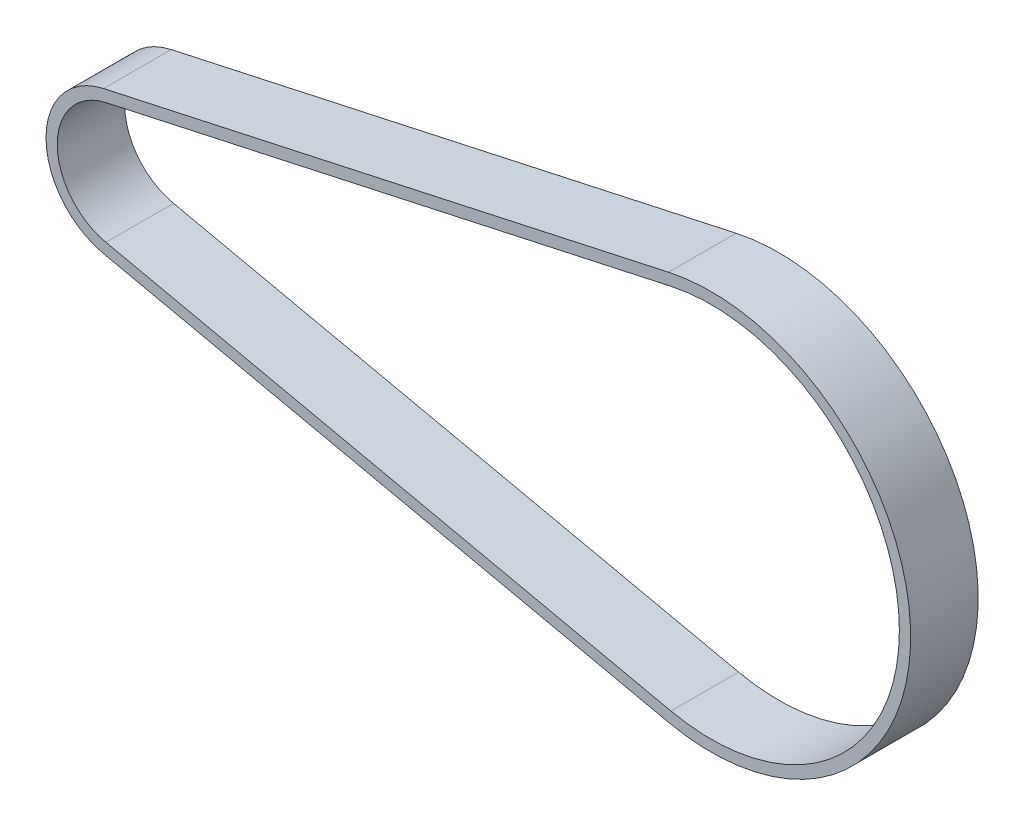
ISO-10303-21;
HEADER;
FILE_DESCRIPTION(('STEP AP214'),'2;1');
FILE_NAME('part.step','',(''),(''),'','','');
FILE_SCHEMA(('AUTOMOTIVE_DESIGN { 1 0 10303 214 1 1 1 1 }'));
ENDSEC;
DATA;
#1=APPLICATION_CONTEXT('core data for automotive mechanical design processes');
#2=APPLICATION_PROTOCOL_DEFINITION('international standard','automotive_design',2000,#1);
#3=PRODUCT_CONTEXT('',#1,'mechanical');
#4=PRODUCT('Part','Part','',(#3));
#5=PRODUCT_RELATED_PRODUCT_CATEGORY('part','',(#4));
#6=PRODUCT_DEFINITION_FORMATION('','',#4);
#7=PRODUCT_DEFINITION_CONTEXT('part definition',#1,'design');
#8=PRODUCT_DEFINITION('design','',#6,#7);
#9=PRODUCT_DEFINITION_SHAPE('','',#8);
#10=(LENGTH_UNIT() NAMED_UNIT(*) SI_UNIT(.MILLI.,.METRE.));
#11=(NAMED_UNIT(*) PLANE_ANGLE_UNIT() SI_UNIT($,.RADIAN.));
#12=(NAMED_UNIT(*) SI_UNIT($,.STERADIAN.) SOLID_ANGLE_UNIT());
#13=UNCERTAINTY_MEASURE_WITH_UNIT(LENGTH_MEASURE(1.E-05),#10,'distance_accuracy_value','');
#14=(GEOMETRIC_REPRESENTATION_CONTEXT(3) GLOBAL_UNCERTAINTY_ASSIGNED_CONTEXT((#13)) GLOBAL_UNIT_ASSIGNED_CONTEXT((#10,
#11,#12)) REPRESENTATION_CONTEXT('',''));
#15=CARTESIAN_POINT('',(0.,0.,0.));
#16=DIRECTION('',(0.,0.,1.));
#17=DIRECTION('',(1.,0.,0.));
#18=AXIS2_PLACEMENT_3D('',#15,#16,#17);
#19=CARTESIAN_POINT('',(0.,0.,6.));
#20=DIRECTION('',(0.,0.,1.));
#21=DIRECTION('',(1.,0.,0.));
#22=AXIS2_PLACEMENT_3D('',#19,#20,#21);
#23=PLANE('',#22);
#24=CARTESIAN_POINT('',(0.,0.,6.));
#25=DIRECTION('',(0.,0.,1.));
#26=DIRECTION('',(1.,0.,0.));
#27=AXIS2_PLACEMENT_3D('',#24,#25,#26);
#28=CIRCLE('',#27,6.5);
#29=CARTESIAN_POINT('',(-1.38716119828816,6.35025856244954,6.));
#30=VERTEX_POINT('',#29);
#31=CARTESIAN_POINT('',(-1.38716119828816,-6.35025856244954,6.));
#32=VERTEX_POINT('',#31);
#33=EDGE_CURVE('E153',#30,#32,#28,.T.);
#34=ORIENTED_EDGE('',*,*,#33,.T.);
#35=DIRECTION('',(0.976962855761468,-0.213409415121255,0.));
#36=VECTOR('',#35,1.);
#37=CARTESIAN_POINT('',(-1.38716119828816,-6.35025856244954,6.));
#38=LINE('',#37,#36);
#39=CARTESIAN_POINT('',(48.7933851640514,-17.3117818040932,6.));
#40=VERTEX_POINT('',#39);
#41=EDGE_CURVE('E157',#32,#40,#38,.T.);
#42=ORIENTED_EDGE('',*,*,#41,.T.);
#43=CARTESIAN_POINT('',(52.575,0.,6.));
#44=DIRECTION('',(0.,0.,1.));
#45=DIRECTION('',(1.,0.,0.));
#46=AXIS2_PLACEMENT_3D('',#43,#44,#45);
#47=CIRCLE('',#46,17.72);
#48=CARTESIAN_POINT('',(48.7933851640514,17.3117818040932,6.));
#49=VERTEX_POINT('',#48);
#50=EDGE_CURVE('E161',#40,#49,#47,.T.);
#51=ORIENTED_EDGE('',*,*,#50,.T.);
#52=DIRECTION('',(-0.976962855761469,-0.213409415121255,0.));
#53=VECTOR('',#52,1.);
#54=CARTESIAN_POINT('',(-1.38716119828816,6.35025856244954,6.));
#55=LINE('',#54,#53);
#56=EDGE_CURVE('E164',#49,#30,#55,.T.);
#57=ORIENTED_EDGE('',*,*,#56,.T.);
#58=EDGE_LOOP('',(#34,#42,#51,#57));
#59=FACE_BOUND('',#58,.T.);
#60=DIRECTION('',(0.976962855761468,-0.213409415121255,0.));
#61=VECTOR('',#60,1.);
#62=CARTESIAN_POINT('',(-1.1737517831669,-5.37329570668807,6.));
#63=LINE('',#62,#61);
#64=CARTESIAN_POINT('',(-1.1737517831669,-5.37329570668807,6.));
#65=VERTEX_POINT('',#64);
#66=CARTESIAN_POINT('',(49.0067945791726,-16.3348189483318,6.));
#67=VERTEX_POINT('',#66);
#68=EDGE_CURVE('E114',#65,#67,#63,.T.);
#69=ORIENTED_EDGE('',*,*,#68,.F.);
#70=CARTESIAN_POINT('',(0.,0.,6.));
#71=DIRECTION('',(0.,0.,1.));
#72=DIRECTION('',(1.,0.,0.));
#73=AXIS2_PLACEMENT_3D('',#70,#71,#72);
#74=CIRCLE('',#73,5.5);
#75=CARTESIAN_POINT('',(-1.1737517831669,5.37329570668808,6.));
#76=VERTEX_POINT('',#75);
#77=EDGE_CURVE('E105',#76,#65,#74,.T.);
#78=ORIENTED_EDGE('',*,*,#77,.F.);
#79=DIRECTION('',(-0.976962855761468,-0.213409415121255,0.));
#80=VECTOR('',#79,1.);
#81=CARTESIAN_POINT('',(-1.1737517831669,5.37329570668808,6.));
#82=LINE('',#81,#80);
#83=CARTESIAN_POINT('',(49.0067945791726,16.3348189483318,6.));
#84=VERTEX_POINT('',#83);
#85=EDGE_CURVE('E131',#84,#76,#82,.T.);
#86=ORIENTED_EDGE('',*,*,#85,.F.);
#87=CARTESIAN_POINT('',(52.575,0.,6.));
#88=DIRECTION('',(0.,0.,1.));
#89=DIRECTION('',(1.,0.,0.));
#90=AXIS2_PLACEMENT_3D('',#87,#88,#89);
#91=CIRCLE('',#90,16.72);
#92=EDGE_CURVE('E127',#67,#84,#91,.T.);
#93=ORIENTED_EDGE('',*,*,#92,.F.);
#94=EDGE_LOOP('',(#69,#78,#86,#93));
#95=FACE_BOUND('',#94,.T.);
#96=ADVANCED_FACE('F39',(#59,#95),#23,.T.);
#97=CARTESIAN_POINT('',(0.,0.,0.));
#98=DIRECTION('',(0.,0.,1.));
#99=DIRECTION('',(1.,0.,0.));
#100=AXIS2_PLACEMENT_3D('',#97,#98,#99);
#101=PLANE('',#100);
#102=CARTESIAN_POINT('',(0.,0.,0.));
#103=DIRECTION('',(0.,0.,1.));
#104=DIRECTION('',(1.,0.,0.));
#105=AXIS2_PLACEMENT_3D('',#102,#103,#104);
#106=CIRCLE('',#105,6.5);
#107=CARTESIAN_POINT('',(-1.38716119828816,6.35025856244954,0.));
#108=VERTEX_POINT('',#107);
#109=CARTESIAN_POINT('',(-1.38716119828816,-6.35025856244954,0.));
#110=VERTEX_POINT('',#109);
#111=EDGE_CURVE('E123',#108,#110,#106,.T.);
#112=ORIENTED_EDGE('',*,*,#111,.F.);
#113=DIRECTION('',(-0.976962855761469,-0.213409415121255,0.));
#114=VECTOR('',#113,1.);
#115=CARTESIAN_POINT('',(-1.38716119828816,6.35025856244954,0.));
#116=LINE('',#115,#114);
#117=CARTESIAN_POINT('',(48.7933851640514,17.3117818040932,0.));
#118=VERTEX_POINT('',#117);
#119=EDGE_CURVE('E158',#118,#108,#116,.T.);
#120=ORIENTED_EDGE('',*,*,#119,.F.);
#121=CARTESIAN_POINT('',(52.575,0.,0.));
#122=DIRECTION('',(0.,0.,1.));
#123=DIRECTION('',(1.,0.,0.));
#124=AXIS2_PLACEMENT_3D('',#121,#122,#123);
#125=CIRCLE('',#124,17.72);
#126=CARTESIAN_POINT('',(48.7933851640514,-17.3117818040932,0.));
#127=VERTEX_POINT('',#126);
#128=EDGE_CURVE('E174',#127,#118,#125,.T.);
#129=ORIENTED_EDGE('',*,*,#128,.F.);
#130=DIRECTION('',(0.976962855761468,-0.213409415121255,0.));
#131=VECTOR('',#130,1.);
#132=CARTESIAN_POINT('',(-1.38716119828816,-6.35025856244954,0.));
#133=LINE('',#132,#131);
#134=EDGE_CURVE('E171',#110,#127,#133,.T.);
#135=ORIENTED_EDGE('',*,*,#134,.F.);
#136=EDGE_LOOP('',(#112,#120,#129,#135));
#137=FACE_BOUND('',#136,.T.);
#138=CARTESIAN_POINT('',(0.,0.,0.));
#139=DIRECTION('',(0.,0.,1.));
#140=DIRECTION('',(1.,0.,0.));
#141=AXIS2_PLACEMENT_3D('',#138,#139,#140);
#142=CIRCLE('',#141,5.5);
#143=CARTESIAN_POINT('',(-1.1737517831669,5.37329570668808,0.));
#144=VERTEX_POINT('',#143);
#145=CARTESIAN_POINT('',(-1.1737517831669,-5.37329570668807,0.));
#146=VERTEX_POINT('',#145);
#147=EDGE_CURVE('E63',#144,#146,#142,.T.);
#148=ORIENTED_EDGE('',*,*,#147,.T.);
#149=DIRECTION('',(0.976962855761468,-0.213409415121255,0.));
#150=VECTOR('',#149,1.);
#151=CARTESIAN_POINT('',(-1.1737517831669,-5.37329570668807,0.));
#152=LINE('',#151,#150);
#153=CARTESIAN_POINT('',(49.0067945791726,-16.3348189483318,0.));
#154=VERTEX_POINT('',#153);
#155=EDGE_CURVE('E121',#146,#154,#152,.T.);
#156=ORIENTED_EDGE('',*,*,#155,.T.);
#157=CARTESIAN_POINT('',(52.575,0.,0.));
#158=DIRECTION('',(0.,0.,1.));
#159=DIRECTION('',(1.,0.,0.));
#160=AXIS2_PLACEMENT_3D('',#157,#158,#159);
#161=CIRCLE('',#160,16.72);
#162=CARTESIAN_POINT('',(49.0067945791726,16.3348189483318,0.));
#163=VERTEX_POINT('',#162);
#164=EDGE_CURVE('E140',#154,#163,#161,.T.);
#165=ORIENTED_EDGE('',*,*,#164,.T.);
#166=DIRECTION('',(-0.976962855761468,-0.213409415121255,0.));
#167=VECTOR('',#166,1.);
#168=CARTESIAN_POINT('',(-1.1737517831669,5.37329570668808,0.));
#169=LINE('',#168,#167);
#170=EDGE_CURVE('E115',#163,#144,#169,.T.);
#171=ORIENTED_EDGE('',*,*,#170,.T.);
#172=EDGE_LOOP('',(#148,#156,#165,#171));
#173=FACE_BOUND('',#172,.T.);
#174=ADVANCED_FACE('F197',(#137,#173),#101,.F.);
#175=CARTESIAN_POINT('',(0.,0.,6.));
#176=DIRECTION('',(0.,0.,-1.));
#177=DIRECTION('',(-1.,0.,0.));
#178=AXIS2_PLACEMENT_3D('',#175,#176,#177);
#179=CYLINDRICAL_SURFACE('',#178,6.5);
#180=ORIENTED_EDGE('',*,*,#111,.T.);
#181=DIRECTION('',(0.,0.,-1.));
#182=VECTOR('',#181,1.);
#183=CARTESIAN_POINT('',(-1.38716119828816,-6.35025856244954,6.));
#184=LINE('',#183,#182);
#185=EDGE_CURVE('E11',#32,#110,#184,.T.);
#186=ORIENTED_EDGE('',*,*,#185,.F.);
#187=ORIENTED_EDGE('',*,*,#33,.F.);
#188=DIRECTION('',(0.,0.,-1.));
#189=VECTOR('',#188,1.);
#190=CARTESIAN_POINT('',(-1.38716119828816,6.35025856244954,6.));
#191=LINE('',#190,#189);
#192=EDGE_CURVE('E167',#30,#108,#191,.T.);
#193=ORIENTED_EDGE('',*,*,#192,.T.);
#194=EDGE_LOOP('',(#180,#186,#187,#193));
#195=FACE_BOUND('',#194,.T.);
#196=ADVANCED_FACE('F41',(#195),#179,.T.);
#197=CARTESIAN_POINT('',(-1.38716119828816,-6.35025856244954,6.));
#198=DIRECTION('',(0.213409415121255,0.976962855761468,0.));
#199=DIRECTION('',(-0.976962855761469,0.213409415121255,0.));
#200=AXIS2_PLACEMENT_3D('',#197,#198,#199);
#201=PLANE('',#200);
#202=ORIENTED_EDGE('',*,*,#134,.T.);
#203=DIRECTION('',(0.,0.,-1.));
#204=VECTOR('',#203,1.);
#205=CARTESIAN_POINT('',(48.7933851640514,-17.3117818040932,6.));
#206=LINE('',#205,#204);
#207=EDGE_CURVE('E48',#40,#127,#206,.T.);
#208=ORIENTED_EDGE('',*,*,#207,.F.);
#209=ORIENTED_EDGE('',*,*,#41,.F.);
#210=ORIENTED_EDGE('',*,*,#185,.T.);
#211=EDGE_LOOP('',(#202,#208,#209,#210));
#212=FACE_BOUND('',#211,.T.);
#213=ADVANCED_FACE('F207',(#212),#201,.F.);
#214=CARTESIAN_POINT('',(52.575,0.,6.));
#215=DIRECTION('',(0.,0.,-1.));
#216=DIRECTION('',(-1.,0.,0.));
#217=AXIS2_PLACEMENT_3D('',#214,#215,#216);
#218=CYLINDRICAL_SURFACE('',#217,17.72);
#219=ORIENTED_EDGE('',*,*,#128,.T.);
#220=DIRECTION('',(0.,0.,-1.));
#221=VECTOR('',#220,1.);
#222=CARTESIAN_POINT('',(48.7933851640514,17.3117818040932,6.));
#223=LINE('',#222,#221);
#224=EDGE_CURVE('E182',#49,#118,#223,.T.);
#225=ORIENTED_EDGE('',*,*,#224,.F.);
#226=ORIENTED_EDGE('',*,*,#50,.F.);
#227=ORIENTED_EDGE('',*,*,#207,.T.);
#228=EDGE_LOOP('',(#219,#225,#226,#227));
#229=FACE_BOUND('',#228,.T.);
#230=ADVANCED_FACE('F191',(#229),#218,.T.);
#231=CARTESIAN_POINT('',(-1.38716119828816,6.35025856244954,6.));
#232=DIRECTION('',(0.213409415121255,-0.976962855761468,0.));
#233=DIRECTION('',(0.976962855761469,0.213409415121255,0.));
#234=AXIS2_PLACEMENT_3D('',#231,#232,#233);
#235=PLANE('',#234);
#236=ORIENTED_EDGE('',*,*,#119,.T.);
#237=ORIENTED_EDGE('',*,*,#192,.F.);
#238=ORIENTED_EDGE('',*,*,#56,.F.);
#239=ORIENTED_EDGE('',*,*,#224,.T.);
#240=EDGE_LOOP('',(#236,#237,#238,#239));
#241=FACE_BOUND('',#240,.T.);
#242=ADVANCED_FACE('F201',(#241),#235,.F.);
#243=CARTESIAN_POINT('',(0.,0.,6.));
#244=DIRECTION('',(0.,0.,-1.));
#245=DIRECTION('',(-1.,0.,0.));
#246=AXIS2_PLACEMENT_3D('',#243,#244,#245);
#247=CYLINDRICAL_SURFACE('',#246,5.5);
#248=ORIENTED_EDGE('',*,*,#147,.F.);
#249=DIRECTION('',(0.,0.,-1.));
#250=VECTOR('',#249,1.);
#251=CARTESIAN_POINT('',(-1.1737517831669,5.37329570668808,6.));
#252=LINE('',#251,#250);
#253=EDGE_CURVE('E109',#76,#144,#252,.T.);
#254=ORIENTED_EDGE('',*,*,#253,.F.);
#255=ORIENTED_EDGE('',*,*,#77,.T.);
#256=DIRECTION('',(0.,0.,-1.));
#257=VECTOR('',#256,1.);
#258=CARTESIAN_POINT('',(-1.1737517831669,-5.37329570668807,6.));
#259=LINE('',#258,#257);
#260=EDGE_CURVE('E108',#65,#146,#259,.T.);
#261=ORIENTED_EDGE('',*,*,#260,.T.);
#262=EDGE_LOOP('',(#248,#254,#255,#261));
#263=FACE_BOUND('',#262,.T.);
#264=ADVANCED_FACE('F107',(#263),#247,.F.);
#265=CARTESIAN_POINT('',(-1.1737517831669,-5.37329570668807,6.));
#266=DIRECTION('',(0.213409415121255,0.976962855761468,0.));
#267=DIRECTION('',(-0.976962855761469,0.213409415121255,0.));
#268=AXIS2_PLACEMENT_3D('',#265,#266,#267);
#269=PLANE('',#268);
#270=ORIENTED_EDGE('',*,*,#155,.F.);
#271=ORIENTED_EDGE('',*,*,#260,.F.);
#272=ORIENTED_EDGE('',*,*,#68,.T.);
#273=DIRECTION('',(0.,0.,-1.));
#274=VECTOR('',#273,1.);
#275=CARTESIAN_POINT('',(49.0067945791726,-16.3348189483318,6.));
#276=LINE('',#275,#274);
#277=EDGE_CURVE('E124',#67,#154,#276,.T.);
#278=ORIENTED_EDGE('',*,*,#277,.T.);
#279=EDGE_LOOP('',(#270,#271,#272,#278));
#280=FACE_BOUND('',#279,.T.);
#281=ADVANCED_FACE('F118',(#280),#269,.T.);
#282=CARTESIAN_POINT('',(52.575,0.,6.));
#283=DIRECTION('',(0.,0.,-1.));
#284=DIRECTION('',(-1.,0.,0.));
#285=AXIS2_PLACEMENT_3D('',#282,#283,#284);
#286=CYLINDRICAL_SURFACE('',#285,16.72);
#287=ORIENTED_EDGE('',*,*,#164,.F.);
#288=ORIENTED_EDGE('',*,*,#277,.F.);
#289=ORIENTED_EDGE('',*,*,#92,.T.);
#290=DIRECTION('',(0.,0.,-1.));
#291=VECTOR('',#290,1.);
#292=CARTESIAN_POINT('',(49.0067945791726,16.3348189483318,6.));
#293=LINE('',#292,#291);
#294=EDGE_CURVE('E55',#84,#163,#293,.T.);
#295=ORIENTED_EDGE('',*,*,#294,.T.);
#296=EDGE_LOOP('',(#287,#288,#289,#295));
#297=FACE_BOUND('',#296,.T.);
#298=ADVANCED_FACE('F230',(#297),#286,.F.);
#299=CARTESIAN_POINT('',(-1.1737517831669,5.37329570668808,6.));
#300=DIRECTION('',(0.213409415121255,-0.976962855761468,0.));
#301=DIRECTION('',(0.976962855761469,0.213409415121255,0.));
#302=AXIS2_PLACEMENT_3D('',#299,#300,#301);
#303=PLANE('',#302);
#304=ORIENTED_EDGE('',*,*,#170,.F.);
#305=ORIENTED_EDGE('',*,*,#294,.F.);
#306=ORIENTED_EDGE('',*,*,#85,.T.);
#307=ORIENTED_EDGE('',*,*,#253,.T.);
#308=EDGE_LOOP('',(#304,#305,#306,#307));
#309=FACE_BOUND('',#308,.T.);
#310=ADVANCED_FACE('F234',(#309),#303,.T.);
#311=CLOSED_SHELL('',(#96,#174,#196,#213,#230,#242,#264,#281,#298,#310));
#312=MANIFOLD_SOLID_BREP('B2',#311);
#313=ADVANCED_BREP_SHAPE_REPRESENTATION('',(#18,#312),#14);
#314=SHAPE_DEFINITION_REPRESENTATION(#9,#313);
ENDSEC;
END-ISO-10303-21;
